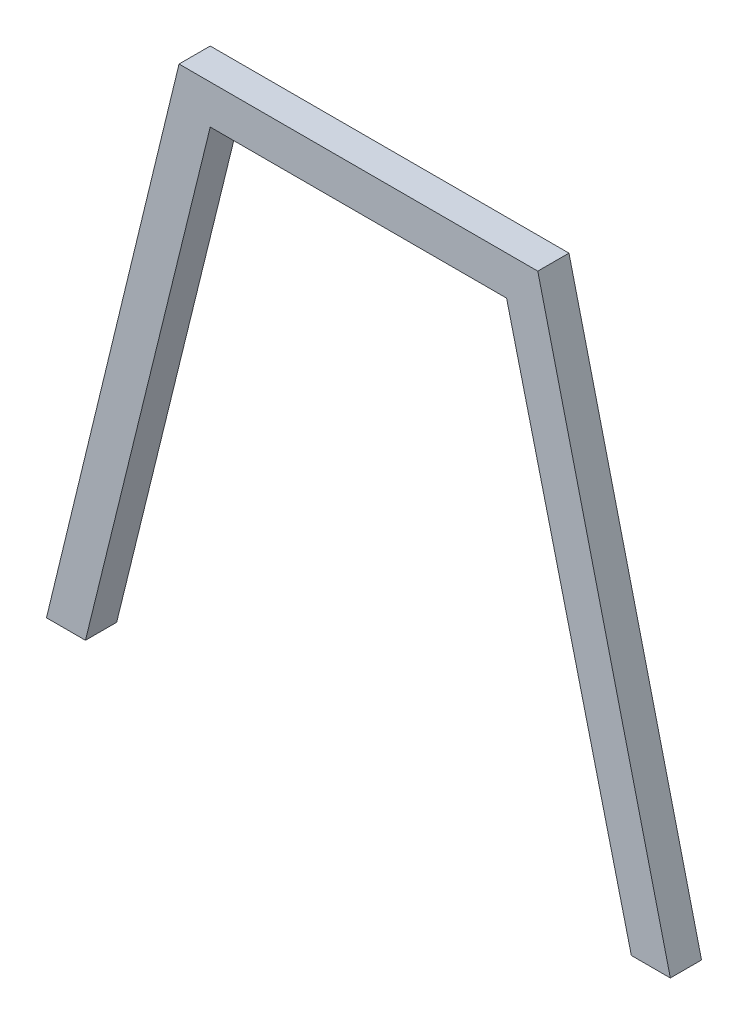
ISO-10303-21;
HEADER;
FILE_DESCRIPTION(('STEP AP214'),'2;1');
FILE_NAME('part.step','',(''),(''),'','','');
FILE_SCHEMA(('AUTOMOTIVE_DESIGN { 1 0 10303 214 1 1 1 1 }'));
ENDSEC;
DATA;
#1=APPLICATION_CONTEXT('core data for automotive mechanical design processes');
#2=APPLICATION_PROTOCOL_DEFINITION('international standard','automotive_design',2000,#1);
#3=PRODUCT_CONTEXT('',#1,'mechanical');
#4=PRODUCT('Part','Part','',(#3));
#5=PRODUCT_RELATED_PRODUCT_CATEGORY('part','',(#4));
#6=PRODUCT_DEFINITION_FORMATION('','',#4);
#7=PRODUCT_DEFINITION_CONTEXT('part definition',#1,'design');
#8=PRODUCT_DEFINITION('design','',#6,#7);
#9=PRODUCT_DEFINITION_SHAPE('','',#8);
#10=(LENGTH_UNIT() NAMED_UNIT(*) SI_UNIT(.MILLI.,.METRE.));
#11=(NAMED_UNIT(*) PLANE_ANGLE_UNIT() SI_UNIT($,.RADIAN.));
#12=(NAMED_UNIT(*) SI_UNIT($,.STERADIAN.) SOLID_ANGLE_UNIT());
#13=UNCERTAINTY_MEASURE_WITH_UNIT(LENGTH_MEASURE(1.E-05),#10,'distance_accuracy_value','');
#14=(GEOMETRIC_REPRESENTATION_CONTEXT(3) GLOBAL_UNCERTAINTY_ASSIGNED_CONTEXT((#13)) GLOBAL_UNIT_ASSIGNED_CONTEXT((#10,
#11,#12)) REPRESENTATION_CONTEXT('',''));
#15=CARTESIAN_POINT('',(0.,0.,0.));
#16=DIRECTION('',(0.,0.,1.));
#17=DIRECTION('',(1.,0.,0.));
#18=AXIS2_PLACEMENT_3D('',#15,#16,#17);
#19=CARTESIAN_POINT('',(-175.,0.,10.));
#20=DIRECTION('',(0.,1.,0.));
#21=DIRECTION('',(0.,0.,1.));
#22=AXIS2_PLACEMENT_3D('',#19,#20,#21);
#23=PLANE('',#22);
#24=DIRECTION('',(1.,0.,0.));
#25=VECTOR('',#24,1.);
#26=CARTESIAN_POINT('',(-175.,0.,-10.));
#27=LINE('',#26,#25);
#28=CARTESIAN_POINT('',(-200.,0.,-10.));
#29=VERTEX_POINT('',#28);
#30=CARTESIAN_POINT('',(-175.,0.,-10.));
#31=VERTEX_POINT('',#30);
#32=EDGE_CURVE('E205',#29,#31,#27,.T.);
#33=ORIENTED_EDGE('',*,*,#32,.T.);
#34=DIRECTION('',(0.,0.,-1.));
#35=VECTOR('',#34,1.);
#36=CARTESIAN_POINT('',(-175.,0.,10.));
#37=LINE('',#36,#35);
#38=CARTESIAN_POINT('',(-175.,0.,10.));
#39=VERTEX_POINT('',#38);
#40=EDGE_CURVE('E230',#39,#31,#37,.T.);
#41=ORIENTED_EDGE('',*,*,#40,.F.);
#42=DIRECTION('',(1.,0.,0.));
#43=VECTOR('',#42,1.);
#44=CARTESIAN_POINT('',(-175.,0.,10.));
#45=LINE('',#44,#43);
#46=CARTESIAN_POINT('',(-200.,0.,10.));
#47=VERTEX_POINT('',#46);
#48=EDGE_CURVE('E216',#47,#39,#45,.T.);
#49=ORIENTED_EDGE('',*,*,#48,.F.);
#50=DIRECTION('',(0.,0.,-1.));
#51=VECTOR('',#50,1.);
#52=CARTESIAN_POINT('',(-200.,0.,10.));
#53=LINE('',#52,#51);
#54=EDGE_CURVE('E198',#47,#29,#53,.T.);
#55=ORIENTED_EDGE('',*,*,#54,.T.);
#56=EDGE_LOOP('',(#33,#41,#49,#55));
#57=FACE_BOUND('',#56,.T.);
#58=ADVANCED_FACE('F45',(#57),#23,.F.);
#59=CARTESIAN_POINT('',(-95.,325.,10.));
#60=DIRECTION('',(-0.971014878934766,0.239019047122404,0.));
#61=DIRECTION('',(-0.239019047122404,-0.971014878934766,0.));
#62=AXIS2_PLACEMENT_3D('',#59,#60,#61);
#63=PLANE('',#62);
#64=DIRECTION('',(0.239019047122404,0.971014878934766,0.));
#65=VECTOR('',#64,1.);
#66=CARTESIAN_POINT('',(-95.,325.,-10.));
#67=LINE('',#66,#65);
#68=CARTESIAN_POINT('',(-95.,325.,-10.));
#69=VERTEX_POINT('',#68);
#70=EDGE_CURVE('E204',#31,#69,#67,.T.);
#71=ORIENTED_EDGE('',*,*,#70,.T.);
#72=DIRECTION('',(0.,0.,-1.));
#73=VECTOR('',#72,1.);
#74=CARTESIAN_POINT('',(-95.,325.,10.));
#75=LINE('',#74,#73);
#76=CARTESIAN_POINT('',(-95.,325.,10.));
#77=VERTEX_POINT('',#76);
#78=EDGE_CURVE('E228',#77,#69,#75,.T.);
#79=ORIENTED_EDGE('',*,*,#78,.F.);
#80=DIRECTION('',(0.239019047122404,0.971014878934766,0.));
#81=VECTOR('',#80,1.);
#82=CARTESIAN_POINT('',(-95.,325.,10.));
#83=LINE('',#82,#81);
#84=EDGE_CURVE('E164',#39,#77,#83,.T.);
#85=ORIENTED_EDGE('',*,*,#84,.F.);
#86=ORIENTED_EDGE('',*,*,#40,.T.);
#87=EDGE_LOOP('',(#71,#79,#85,#86));
#88=FACE_BOUND('',#87,.T.);
#89=ADVANCED_FACE('F453',(#88),#63,.F.);
#90=CARTESIAN_POINT('',(95.,325.,10.));
#91=DIRECTION('',(0.,1.,0.));
#92=DIRECTION('',(0.,0.,1.));
#93=AXIS2_PLACEMENT_3D('',#90,#91,#92);
#94=PLANE('',#93);
#95=DIRECTION('',(1.,0.,0.));
#96=VECTOR('',#95,1.);
#97=CARTESIAN_POINT('',(95.,325.,-10.));
#98=LINE('',#97,#96);
#99=CARTESIAN_POINT('',(95.,325.,-10.));
#100=VERTEX_POINT('',#99);
#101=EDGE_CURVE('E210',#69,#100,#98,.T.);
#102=ORIENTED_EDGE('',*,*,#101,.T.);
#103=DIRECTION('',(0.,0.,-1.));
#104=VECTOR('',#103,1.);
#105=CARTESIAN_POINT('',(95.,325.,10.));
#106=LINE('',#105,#104);
#107=CARTESIAN_POINT('',(95.,325.,10.));
#108=VERTEX_POINT('',#107);
#109=EDGE_CURVE('E221',#108,#100,#106,.T.);
#110=ORIENTED_EDGE('',*,*,#109,.F.);
#111=DIRECTION('',(1.,0.,0.));
#112=VECTOR('',#111,1.);
#113=CARTESIAN_POINT('',(95.,325.,10.));
#114=LINE('',#113,#112);
#115=EDGE_CURVE('E484',#77,#108,#114,.T.);
#116=ORIENTED_EDGE('',*,*,#115,.F.);
#117=ORIENTED_EDGE('',*,*,#78,.T.);
#118=EDGE_LOOP('',(#102,#110,#116,#117));
#119=FACE_BOUND('',#118,.T.);
#120=ADVANCED_FACE('F445',(#119),#94,.F.);
#121=CARTESIAN_POINT('',(175.,0.,10.));
#122=DIRECTION('',(0.971014878934766,0.239019047122404,0.));
#123=DIRECTION('',(-0.239019047122404,0.971014878934766,0.));
#124=AXIS2_PLACEMENT_3D('',#121,#122,#123);
#125=PLANE('',#124);
#126=DIRECTION('',(0.239019047122404,-0.971014878934766,0.));
#127=VECTOR('',#126,1.);
#128=CARTESIAN_POINT('',(175.,0.,-10.));
#129=LINE('',#128,#127);
#130=CARTESIAN_POINT('',(175.,0.,-10.));
#131=VERTEX_POINT('',#130);
#132=EDGE_CURVE('E209',#100,#131,#129,.T.);
#133=ORIENTED_EDGE('',*,*,#132,.T.);
#134=DIRECTION('',(0.,0.,-1.));
#135=VECTOR('',#134,1.);
#136=CARTESIAN_POINT('',(175.,0.,10.));
#137=LINE('',#136,#135);
#138=CARTESIAN_POINT('',(175.,0.,10.));
#139=VERTEX_POINT('',#138);
#140=EDGE_CURVE('E219',#139,#131,#137,.T.);
#141=ORIENTED_EDGE('',*,*,#140,.F.);
#142=DIRECTION('',(0.239019047122404,-0.971014878934766,0.));
#143=VECTOR('',#142,1.);
#144=CARTESIAN_POINT('',(175.,0.,10.));
#145=LINE('',#144,#143);
#146=EDGE_CURVE('E487',#108,#139,#145,.T.);
#147=ORIENTED_EDGE('',*,*,#146,.F.);
#148=ORIENTED_EDGE('',*,*,#109,.T.);
#149=EDGE_LOOP('',(#133,#141,#147,#148));
#150=FACE_BOUND('',#149,.T.);
#151=ADVANCED_FACE('F433',(#150),#125,.F.);
#152=CARTESIAN_POINT('',(200.,0.,10.));
#153=DIRECTION('',(0.,1.,0.));
#154=DIRECTION('',(0.,0.,1.));
#155=AXIS2_PLACEMENT_3D('',#152,#153,#154);
#156=PLANE('',#155);
#157=DIRECTION('',(1.,0.,0.));
#158=VECTOR('',#157,1.);
#159=CARTESIAN_POINT('',(200.,0.,-10.));
#160=LINE('',#159,#158);
#161=CARTESIAN_POINT('',(200.,0.,-10.));
#162=VERTEX_POINT('',#161);
#163=EDGE_CURVE('E213',#131,#162,#160,.T.);
#164=ORIENTED_EDGE('',*,*,#163,.T.);
#165=DIRECTION('',(0.,0.,-1.));
#166=VECTOR('',#165,1.);
#167=CARTESIAN_POINT('',(200.,0.,10.));
#168=LINE('',#167,#166);
#169=CARTESIAN_POINT('',(200.,0.,10.));
#170=VERTEX_POINT('',#169);
#171=EDGE_CURVE('E192',#170,#162,#168,.T.);
#172=ORIENTED_EDGE('',*,*,#171,.F.);
#173=DIRECTION('',(1.,0.,0.));
#174=VECTOR('',#173,1.);
#175=CARTESIAN_POINT('',(200.,0.,10.));
#176=LINE('',#175,#174);
#177=EDGE_CURVE('E183',#139,#170,#176,.T.);
#178=ORIENTED_EDGE('',*,*,#177,.F.);
#179=ORIENTED_EDGE('',*,*,#140,.T.);
#180=EDGE_LOOP('',(#164,#172,#178,#179));
#181=FACE_BOUND('',#180,.T.);
#182=ADVANCED_FACE('F424',(#181),#156,.F.);
#183=CARTESIAN_POINT('',(115.,350.,10.));
#184=DIRECTION('',(-0.971753703944221,-0.235997328100739,0.));
#185=DIRECTION('',(0.235997328100739,-0.971753703944221,0.));
#186=AXIS2_PLACEMENT_3D('',#183,#184,#185);
#187=PLANE('',#186);
#188=DIRECTION('',(-0.235997328100739,0.971753703944221,0.));
#189=VECTOR('',#188,1.);
#190=CARTESIAN_POINT('',(115.,350.,-10.));
#191=LINE('',#190,#189);
#192=CARTESIAN_POINT('',(115.,350.,-10.));
#193=VERTEX_POINT('',#192);
#194=EDGE_CURVE('E194',#162,#193,#191,.T.);
#195=ORIENTED_EDGE('',*,*,#194,.T.);
#196=DIRECTION('',(0.,0.,-1.));
#197=VECTOR('',#196,1.);
#198=CARTESIAN_POINT('',(115.,350.,10.));
#199=LINE('',#198,#197);
#200=CARTESIAN_POINT('',(115.,350.,10.));
#201=VERTEX_POINT('',#200);
#202=EDGE_CURVE('E186',#201,#193,#199,.T.);
#203=ORIENTED_EDGE('',*,*,#202,.F.);
#204=DIRECTION('',(-0.235997328100739,0.971753703944221,0.));
#205=VECTOR('',#204,1.);
#206=CARTESIAN_POINT('',(115.,350.,10.));
#207=LINE('',#206,#205);
#208=EDGE_CURVE('E178',#170,#201,#207,.T.);
#209=ORIENTED_EDGE('',*,*,#208,.F.);
#210=ORIENTED_EDGE('',*,*,#171,.T.);
#211=EDGE_LOOP('',(#195,#203,#209,#210));
#212=FACE_BOUND('',#211,.T.);
#213=ADVANCED_FACE('F188',(#212),#187,.F.);
#214=CARTESIAN_POINT('',(-115.,350.,10.));
#215=DIRECTION('',(0.,-1.,0.));
#216=DIRECTION('',(0.,0.,-1.));
#217=AXIS2_PLACEMENT_3D('',#214,#215,#216);
#218=PLANE('',#217);
#219=DIRECTION('',(-1.,0.,0.));
#220=VECTOR('',#219,1.);
#221=CARTESIAN_POINT('',(-115.,350.,-10.));
#222=LINE('',#221,#220);
#223=CARTESIAN_POINT('',(-115.,350.,-10.));
#224=VERTEX_POINT('',#223);
#225=EDGE_CURVE('E146',#193,#224,#222,.T.);
#226=ORIENTED_EDGE('',*,*,#225,.T.);
#227=DIRECTION('',(0.,0.,-1.));
#228=VECTOR('',#227,1.);
#229=CARTESIAN_POINT('',(-115.,350.,10.));
#230=LINE('',#229,#228);
#231=CARTESIAN_POINT('',(-115.,350.,10.));
#232=VERTEX_POINT('',#231);
#233=EDGE_CURVE('E195',#232,#224,#230,.T.);
#234=ORIENTED_EDGE('',*,*,#233,.F.);
#235=DIRECTION('',(-1.,0.,0.));
#236=VECTOR('',#235,1.);
#237=CARTESIAN_POINT('',(-115.,350.,10.));
#238=LINE('',#237,#236);
#239=EDGE_CURVE('E185',#201,#232,#238,.T.);
#240=ORIENTED_EDGE('',*,*,#239,.F.);
#241=ORIENTED_EDGE('',*,*,#202,.T.);
#242=EDGE_LOOP('',(#226,#234,#240,#241));
#243=FACE_BOUND('',#242,.T.);
#244=ADVANCED_FACE('F196',(#243),#218,.F.);
#245=CARTESIAN_POINT('',(-200.,0.,10.));
#246=DIRECTION('',(0.971753703944221,-0.235997328100739,0.));
#247=DIRECTION('',(0.235997328100739,0.971753703944221,0.));
#248=AXIS2_PLACEMENT_3D('',#245,#246,#247);
#249=PLANE('',#248);
#250=DIRECTION('',(-0.235997328100739,-0.971753703944221,0.));
#251=VECTOR('',#250,1.);
#252=CARTESIAN_POINT('',(-200.,0.,-10.));
#253=LINE('',#252,#251);
#254=EDGE_CURVE('E158',#224,#29,#253,.T.);
#255=ORIENTED_EDGE('',*,*,#254,.T.);
#256=ORIENTED_EDGE('',*,*,#54,.F.);
#257=DIRECTION('',(-0.235997328100739,-0.971753703944221,0.));
#258=VECTOR('',#257,1.);
#259=CARTESIAN_POINT('',(-200.,0.,10.));
#260=LINE('',#259,#258);
#261=EDGE_CURVE('E122',#232,#47,#260,.T.);
#262=ORIENTED_EDGE('',*,*,#261,.F.);
#263=ORIENTED_EDGE('',*,*,#233,.T.);
#264=EDGE_LOOP('',(#255,#256,#262,#263));
#265=FACE_BOUND('',#264,.T.);
#266=ADVANCED_FACE('F401',(#265),#249,.F.);
#267=CARTESIAN_POINT('',(0.,0.,10.));
#268=DIRECTION('',(0.,0.,-1.));
#269=DIRECTION('',(-1.,0.,0.));
#270=AXIS2_PLACEMENT_3D('',#267,#268,#269);
#271=PLANE('',#270);
#272=ORIENTED_EDGE('',*,*,#48,.T.);
#273=ORIENTED_EDGE('',*,*,#84,.T.);
#274=ORIENTED_EDGE('',*,*,#115,.T.);
#275=ORIENTED_EDGE('',*,*,#146,.T.);
#276=ORIENTED_EDGE('',*,*,#177,.T.);
#277=ORIENTED_EDGE('',*,*,#208,.T.);
#278=ORIENTED_EDGE('',*,*,#239,.T.);
#279=ORIENTED_EDGE('',*,*,#261,.T.);
#280=EDGE_LOOP('',(#272,#273,#274,#275,#276,#277,#278,#279));
#281=FACE_BOUND('',#280,.T.);
#282=ADVANCED_FACE('F179',(#281),#271,.F.);
#283=CARTESIAN_POINT('',(0.,0.,-10.));
#284=DIRECTION('',(0.,0.,-1.));
#285=DIRECTION('',(-1.,0.,0.));
#286=AXIS2_PLACEMENT_3D('',#283,#284,#285);
#287=PLANE('',#286);
#288=ORIENTED_EDGE('',*,*,#32,.F.);
#289=ORIENTED_EDGE('',*,*,#254,.F.);
#290=ORIENTED_EDGE('',*,*,#225,.F.);
#291=ORIENTED_EDGE('',*,*,#194,.F.);
#292=ORIENTED_EDGE('',*,*,#163,.F.);
#293=ORIENTED_EDGE('',*,*,#132,.F.);
#294=ORIENTED_EDGE('',*,*,#101,.F.);
#295=ORIENTED_EDGE('',*,*,#70,.F.);
#296=EDGE_LOOP('',(#288,#289,#290,#291,#292,#293,#294,#295));
#297=FACE_BOUND('',#296,.T.);
#298=ADVANCED_FACE('F395',(#297),#287,.T.);
#299=CLOSED_SHELL('',(#58,#89,#120,#151,#182,#213,#244,#266,#282,#298));
#300=CARTESIAN_POINT('',(-175.,2.,10.));
#301=DIRECTION('',(0.,1.,0.));
#302=DIRECTION('',(0.,0.,1.));
#303=AXIS2_PLACEMENT_3D('',#300,#301,#302);
#304=PLANE('',#303);
#305=DIRECTION('',(1.,0.,0.));
#306=VECTOR('',#305,1.);
#307=CARTESIAN_POINT('',(0.,2.,-8.));
#308=LINE('',#307,#306);
#309=CARTESIAN_POINT('',(-197.456151032748,2.,-8.));
#310=VERTEX_POINT('',#309);
#311=CARTESIAN_POINT('',(-176.567392981068,2.,-8.));
#312=VERTEX_POINT('',#311);
#313=EDGE_CURVE('E46',#310,#312,#308,.T.);
#314=ORIENTED_EDGE('',*,*,#313,.F.);
#315=DIRECTION('',(0.,0.,-1.));
#316=VECTOR('',#315,1.);
#317=CARTESIAN_POINT('',(-197.456151032748,2.,10.));
#318=LINE('',#317,#316);
#319=CARTESIAN_POINT('',(-197.456151032748,2.,8.));
#320=VERTEX_POINT('',#319);
#321=EDGE_CURVE('E274',#320,#310,#318,.T.);
#322=ORIENTED_EDGE('',*,*,#321,.F.);
#323=DIRECTION('',(1.,0.,0.));
#324=VECTOR('',#323,1.);
#325=CARTESIAN_POINT('',(0.,2.,8.));
#326=LINE('',#325,#324);
#327=CARTESIAN_POINT('',(-176.567392981068,2.,8.));
#328=VERTEX_POINT('',#327);
#329=EDGE_CURVE('E241',#320,#328,#326,.T.);
#330=ORIENTED_EDGE('',*,*,#329,.T.);
#331=DIRECTION('',(0.,0.,-1.));
#332=VECTOR('',#331,1.);
#333=CARTESIAN_POINT('',(-176.567392981068,2.,10.));
#334=LINE('',#333,#332);
#335=EDGE_CURVE('E275',#328,#312,#334,.T.);
#336=ORIENTED_EDGE('',*,*,#335,.T.);
#337=EDGE_LOOP('',(#314,#322,#330,#336));
#338=FACE_BOUND('',#337,.T.);
#339=ADVANCED_FACE('F281',(#338),#304,.T.);
#340=CARTESIAN_POINT('',(-96.9420297578695,325.478038094245,10.));
#341=DIRECTION('',(-0.971014878934766,0.239019047122404,0.));
#342=DIRECTION('',(-0.239019047122404,-0.971014878934766,0.));
#343=AXIS2_PLACEMENT_3D('',#340,#341,#342);
#344=PLANE('',#343);
#345=DIRECTION('',(0.239019047122404,0.971014878934766,0.));
#346=VECTOR('',#345,1.);
#347=CARTESIAN_POINT('',(-166.944261402592,41.0939720375611,-8.));
#348=LINE('',#347,#346);
#349=CARTESIAN_POINT('',(-96.5673929810682,327.,-8.));
#350=VERTEX_POINT('',#349);
#351=EDGE_CURVE('E64',#312,#350,#348,.T.);
#352=ORIENTED_EDGE('',*,*,#351,.F.);
#353=ORIENTED_EDGE('',*,*,#335,.F.);
#354=DIRECTION('',(0.239019047122404,0.971014878934766,0.));
#355=VECTOR('',#354,1.);
#356=CARTESIAN_POINT('',(-166.944261402592,41.0939720375611,8.));
#357=LINE('',#356,#355);
#358=CARTESIAN_POINT('',(-96.5673929810682,327.,8.));
#359=VERTEX_POINT('',#358);
#360=EDGE_CURVE('E107',#328,#359,#357,.T.);
#361=ORIENTED_EDGE('',*,*,#360,.T.);
#362=DIRECTION('',(0.,0.,-1.));
#363=VECTOR('',#362,1.);
#364=CARTESIAN_POINT('',(-96.5673929810682,327.,10.));
#365=LINE('',#364,#363);
#366=EDGE_CURVE('E266',#359,#350,#365,.T.);
#367=ORIENTED_EDGE('',*,*,#366,.T.);
#368=EDGE_LOOP('',(#352,#353,#361,#367));
#369=FACE_BOUND('',#368,.T.);
#370=ADVANCED_FACE('F285',(#369),#344,.T.);
#371=CARTESIAN_POINT('',(95.,327.,10.));
#372=DIRECTION('',(0.,1.,0.));
#373=DIRECTION('',(0.,0.,1.));
#374=AXIS2_PLACEMENT_3D('',#371,#372,#373);
#375=PLANE('',#374);
#376=DIRECTION('',(1.,0.,0.));
#377=VECTOR('',#376,1.);
#378=CARTESIAN_POINT('',(0.,327.,-8.));
#379=LINE('',#378,#377);
#380=CARTESIAN_POINT('',(96.5673929810682,327.,-8.));
#381=VERTEX_POINT('',#380);
#382=EDGE_CURVE('E269',#350,#381,#379,.T.);
#383=ORIENTED_EDGE('',*,*,#382,.F.);
#384=ORIENTED_EDGE('',*,*,#366,.F.);
#385=DIRECTION('',(1.,0.,0.));
#386=VECTOR('',#385,1.);
#387=CARTESIAN_POINT('',(0.,327.,8.));
#388=LINE('',#387,#386);
#389=CARTESIAN_POINT('',(96.5673929810682,327.,8.));
#390=VERTEX_POINT('',#389);
#391=EDGE_CURVE('E238',#359,#390,#388,.T.);
#392=ORIENTED_EDGE('',*,*,#391,.T.);
#393=DIRECTION('',(0.,0.,-1.));
#394=VECTOR('',#393,1.);
#395=CARTESIAN_POINT('',(96.5673929810682,327.,10.));
#396=LINE('',#395,#394);
#397=EDGE_CURVE('E263',#390,#381,#396,.T.);
#398=ORIENTED_EDGE('',*,*,#397,.T.);
#399=EDGE_LOOP('',(#383,#384,#392,#398));
#400=FACE_BOUND('',#399,.T.);
#401=ADVANCED_FACE('F288',(#400),#375,.T.);
#402=CARTESIAN_POINT('',(176.94202975787,0.478038094244808,10.));
#403=DIRECTION('',(0.971014878934766,0.239019047122404,0.));
#404=DIRECTION('',(-0.239019047122404,0.971014878934766,0.));
#405=AXIS2_PLACEMENT_3D('',#402,#403,#404);
#406=PLANE('',#405);
#407=DIRECTION('',(0.239019047122404,-0.971014878934766,0.));
#408=VECTOR('',#407,1.);
#409=CARTESIAN_POINT('',(166.944261402592,41.0939720375611,-8.));
#410=LINE('',#409,#408);
#411=CARTESIAN_POINT('',(176.567392981068,2.,-8.));
#412=VERTEX_POINT('',#411);
#413=EDGE_CURVE('E268',#381,#412,#410,.T.);
#414=ORIENTED_EDGE('',*,*,#413,.F.);
#415=ORIENTED_EDGE('',*,*,#397,.F.);
#416=DIRECTION('',(0.239019047122404,-0.971014878934766,0.));
#417=VECTOR('',#416,1.);
#418=CARTESIAN_POINT('',(166.944261402592,41.0939720375611,8.));
#419=LINE('',#418,#417);
#420=CARTESIAN_POINT('',(176.567392981068,2.,8.));
#421=VERTEX_POINT('',#420);
#422=EDGE_CURVE('E236',#390,#421,#419,.T.);
#423=ORIENTED_EDGE('',*,*,#422,.T.);
#424=DIRECTION('',(0.,0.,-1.));
#425=VECTOR('',#424,1.);
#426=CARTESIAN_POINT('',(176.567392981068,2.,10.));
#427=LINE('',#426,#425);
#428=EDGE_CURVE('E257',#421,#412,#427,.T.);
#429=ORIENTED_EDGE('',*,*,#428,.T.);
#430=EDGE_LOOP('',(#414,#415,#423,#429));
#431=FACE_BOUND('',#430,.T.);
#432=ADVANCED_FACE('F294',(#431),#406,.T.);
#433=CARTESIAN_POINT('',(200.,2.,10.));
#434=DIRECTION('',(0.,1.,0.));
#435=DIRECTION('',(0.,0.,1.));
#436=AXIS2_PLACEMENT_3D('',#433,#434,#435);
#437=PLANE('',#436);
#438=DIRECTION('',(1.,0.,0.));
#439=VECTOR('',#438,1.);
#440=CARTESIAN_POINT('',(0.,2.,-8.));
#441=LINE('',#440,#439);
#442=CARTESIAN_POINT('',(197.456151032748,2.,-8.));
#443=VERTEX_POINT('',#442);
#444=EDGE_CURVE('E261',#412,#443,#441,.T.);
#445=ORIENTED_EDGE('',*,*,#444,.F.);
#446=ORIENTED_EDGE('',*,*,#428,.F.);
#447=DIRECTION('',(1.,0.,0.));
#448=VECTOR('',#447,1.);
#449=CARTESIAN_POINT('',(0.,2.,8.));
#450=LINE('',#449,#448);
#451=CARTESIAN_POINT('',(197.456151032748,2.,8.));
#452=VERTEX_POINT('',#451);
#453=EDGE_CURVE('E234',#421,#452,#450,.T.);
#454=ORIENTED_EDGE('',*,*,#453,.T.);
#455=DIRECTION('',(0.,0.,-1.));
#456=VECTOR('',#455,1.);
#457=CARTESIAN_POINT('',(197.456151032748,2.,10.));
#458=LINE('',#457,#456);
#459=EDGE_CURVE('E254',#452,#443,#458,.T.);
#460=ORIENTED_EDGE('',*,*,#459,.T.);
#461=EDGE_LOOP('',(#445,#446,#454,#460));
#462=FACE_BOUND('',#461,.T.);
#463=ADVANCED_FACE('F296',(#462),#437,.T.);
#464=CARTESIAN_POINT('',(113.056492592112,349.528005343799,10.));
#465=DIRECTION('',(-0.971753703944221,-0.235997328100739,0.));
#466=DIRECTION('',(0.235997328100739,-0.971753703944221,0.));
#467=AXIS2_PLACEMENT_3D('',#464,#465,#466);
#468=PLANE('',#467);
#469=DIRECTION('',(-0.235997328100739,0.971753703944221,0.));
#470=VECTOR('',#469,1.);
#471=CARTESIAN_POINT('',(186.917544817974,45.3942608843651,-8.));
#472=LINE('',#471,#470);
#473=CARTESIAN_POINT('',(113.427579604177,348.,-8.));
#474=VERTEX_POINT('',#473);
#475=EDGE_CURVE('E258',#443,#474,#472,.T.);
#476=ORIENTED_EDGE('',*,*,#475,.F.);
#477=ORIENTED_EDGE('',*,*,#459,.F.);
#478=DIRECTION('',(-0.235997328100739,0.971753703944221,0.));
#479=VECTOR('',#478,1.);
#480=CARTESIAN_POINT('',(186.917544817974,45.3942608843651,8.));
#481=LINE('',#480,#479);
#482=CARTESIAN_POINT('',(113.427579604177,348.,8.));
#483=VERTEX_POINT('',#482);
#484=EDGE_CURVE('E235',#452,#483,#481,.T.);
#485=ORIENTED_EDGE('',*,*,#484,.T.);
#486=DIRECTION('',(0.,0.,-1.));
#487=VECTOR('',#486,1.);
#488=CARTESIAN_POINT('',(113.427579604177,348.,10.));
#489=LINE('',#488,#487);
#490=EDGE_CURVE('E247',#483,#474,#489,.T.);
#491=ORIENTED_EDGE('',*,*,#490,.T.);
#492=EDGE_LOOP('',(#476,#477,#485,#491));
#493=FACE_BOUND('',#492,.T.);
#494=ADVANCED_FACE('F302',(#493),#468,.T.);
#495=CARTESIAN_POINT('',(-115.,348.,10.));
#496=DIRECTION('',(0.,-1.,0.));
#497=DIRECTION('',(0.,0.,-1.));
#498=AXIS2_PLACEMENT_3D('',#495,#496,#497);
#499=PLANE('',#498);
#500=DIRECTION('',(-1.,0.,0.));
#501=VECTOR('',#500,1.);
#502=CARTESIAN_POINT('',(0.,348.,-8.));
#503=LINE('',#502,#501);
#504=CARTESIAN_POINT('',(-113.427579604177,348.,-8.));
#505=VERTEX_POINT('',#504);
#506=EDGE_CURVE('E252',#474,#505,#503,.T.);
#507=ORIENTED_EDGE('',*,*,#506,.F.);
#508=ORIENTED_EDGE('',*,*,#490,.F.);
#509=DIRECTION('',(-1.,0.,0.));
#510=VECTOR('',#509,1.);
#511=CARTESIAN_POINT('',(0.,348.,8.));
#512=LINE('',#511,#510);
#513=CARTESIAN_POINT('',(-113.427579604177,348.,8.));
#514=VERTEX_POINT('',#513);
#515=EDGE_CURVE('E52',#483,#514,#512,.T.);
#516=ORIENTED_EDGE('',*,*,#515,.T.);
#517=DIRECTION('',(0.,0.,-1.));
#518=VECTOR('',#517,1.);
#519=CARTESIAN_POINT('',(-113.427579604177,348.,10.));
#520=LINE('',#519,#518);
#521=EDGE_CURVE('E243',#514,#505,#520,.T.);
#522=ORIENTED_EDGE('',*,*,#521,.T.);
#523=EDGE_LOOP('',(#507,#508,#516,#522));
#524=FACE_BOUND('',#523,.T.);
#525=ADVANCED_FACE('F310',(#524),#499,.T.);
#526=CARTESIAN_POINT('',(-198.056492592112,-0.471994656201479,10.));
#527=DIRECTION('',(0.971753703944221,-0.235997328100739,0.));
#528=DIRECTION('',(0.235997328100739,0.971753703944221,0.));
#529=AXIS2_PLACEMENT_3D('',#526,#527,#528);
#530=PLANE('',#529);
#531=DIRECTION('',(-0.235997328100739,-0.971753703944221,0.));
#532=VECTOR('',#531,1.);
#533=CARTESIAN_POINT('',(-186.917544817974,45.3942608843651,-8.));
#534=LINE('',#533,#532);
#535=EDGE_CURVE('E246',#505,#310,#534,.T.);
#536=ORIENTED_EDGE('',*,*,#535,.F.);
#537=ORIENTED_EDGE('',*,*,#521,.F.);
#538=DIRECTION('',(-0.235997328100739,-0.971753703944221,0.));
#539=VECTOR('',#538,1.);
#540=CARTESIAN_POINT('',(-186.917544817974,45.3942608843651,8.));
#541=LINE('',#540,#539);
#542=EDGE_CURVE('E11',#514,#320,#541,.T.);
#543=ORIENTED_EDGE('',*,*,#542,.T.);
#544=ORIENTED_EDGE('',*,*,#321,.T.);
#545=EDGE_LOOP('',(#536,#537,#543,#544));
#546=FACE_BOUND('',#545,.T.);
#547=ADVANCED_FACE('F309',(#546),#530,.T.);
#548=CARTESIAN_POINT('',(0.,0.,8.));
#549=DIRECTION('',(0.,0.,-1.));
#550=DIRECTION('',(-1.,0.,0.));
#551=AXIS2_PLACEMENT_3D('',#548,#549,#550);
#552=PLANE('',#551);
#553=ORIENTED_EDGE('',*,*,#329,.F.);
#554=ORIENTED_EDGE('',*,*,#542,.F.);
#555=ORIENTED_EDGE('',*,*,#515,.F.);
#556=ORIENTED_EDGE('',*,*,#484,.F.);
#557=ORIENTED_EDGE('',*,*,#453,.F.);
#558=ORIENTED_EDGE('',*,*,#422,.F.);
#559=ORIENTED_EDGE('',*,*,#391,.F.);
#560=ORIENTED_EDGE('',*,*,#360,.F.);
#561=EDGE_LOOP('',(#553,#554,#555,#556,#557,#558,#559,#560));
#562=FACE_BOUND('',#561,.T.);
#563=ADVANCED_FACE('F287',(#562),#552,.T.);
#564=CARTESIAN_POINT('',(0.,0.,-8.));
#565=DIRECTION('',(0.,0.,-1.));
#566=DIRECTION('',(-1.,0.,0.));
#567=AXIS2_PLACEMENT_3D('',#564,#565,#566);
#568=PLANE('',#567);
#569=ORIENTED_EDGE('',*,*,#313,.T.);
#570=ORIENTED_EDGE('',*,*,#351,.T.);
#571=ORIENTED_EDGE('',*,*,#382,.T.);
#572=ORIENTED_EDGE('',*,*,#413,.T.);
#573=ORIENTED_EDGE('',*,*,#444,.T.);
#574=ORIENTED_EDGE('',*,*,#475,.T.);
#575=ORIENTED_EDGE('',*,*,#506,.T.);
#576=ORIENTED_EDGE('',*,*,#535,.T.);
#577=EDGE_LOOP('',(#569,#570,#571,#572,#573,#574,#575,#576));
#578=FACE_BOUND('',#577,.T.);
#579=ADVANCED_FACE('F42',(#578),#568,.F.);
#580=CLOSED_SHELL('',(#339,#370,#401,#432,#463,#494,#525,#547,#563,#579));
#581=ORIENTED_CLOSED_SHELL('',*,#580,.T.);
#582=BREP_WITH_VOIDS('B2',#299,(#581));
#583=ADVANCED_BREP_SHAPE_REPRESENTATION('',(#18,#582),#14);
#584=SHAPE_DEFINITION_REPRESENTATION(#9,#583);
ENDSEC;
END-ISO-10303-21;
